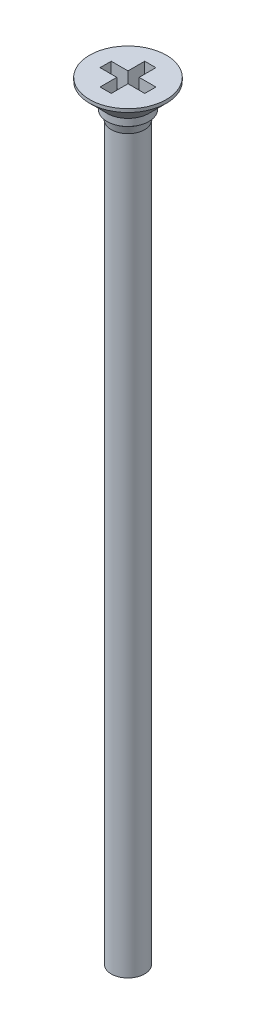
ISO-10303-21;
HEADER;
FILE_DESCRIPTION(('STEP AP214'),'2;1');
FILE_NAME('part.step','',(''),(''),'','','');
FILE_SCHEMA(('AUTOMOTIVE_DESIGN { 1 0 10303 214 1 1 1 1 }'));
ENDSEC;
DATA;
#1=APPLICATION_CONTEXT('core data for automotive mechanical design processes');
#2=APPLICATION_PROTOCOL_DEFINITION('international standard','automotive_design',2000,#1);
#3=PRODUCT_CONTEXT('',#1,'mechanical');
#4=PRODUCT('Part','Part','',(#3));
#5=PRODUCT_RELATED_PRODUCT_CATEGORY('part','',(#4));
#6=PRODUCT_DEFINITION_FORMATION('','',#4);
#7=PRODUCT_DEFINITION_CONTEXT('part definition',#1,'design');
#8=PRODUCT_DEFINITION('design','',#6,#7);
#9=PRODUCT_DEFINITION_SHAPE('','',#8);
#10=(LENGTH_UNIT() NAMED_UNIT(*) SI_UNIT(.MILLI.,.METRE.));
#11=(NAMED_UNIT(*) PLANE_ANGLE_UNIT() SI_UNIT($,.RADIAN.));
#12=(NAMED_UNIT(*) SI_UNIT($,.STERADIAN.) SOLID_ANGLE_UNIT());
#13=UNCERTAINTY_MEASURE_WITH_UNIT(LENGTH_MEASURE(1.E-05),#10,'distance_accuracy_value','');
#14=(GEOMETRIC_REPRESENTATION_CONTEXT(3) GLOBAL_UNCERTAINTY_ASSIGNED_CONTEXT((#13)) GLOBAL_UNIT_ASSIGNED_CONTEXT((#10,
#11,#12)) REPRESENTATION_CONTEXT('',''));
#15=CARTESIAN_POINT('',(0.,0.,0.));
#16=DIRECTION('',(0.,0.,1.));
#17=DIRECTION('',(1.,0.,0.));
#18=AXIS2_PLACEMENT_3D('',#15,#16,#17);
#19=CARTESIAN_POINT('',(0.,-2.65,-0.4));
#20=DIRECTION('',(0.,0.,-1.));
#21=DIRECTION('',(-1.,0.,0.));
#22=AXIS2_PLACEMENT_3D('',#19,#20,#21);
#23=PLANE('',#22);
#24=DIRECTION('',(0.,1.,0.));
#25=VECTOR('',#24,1.);
#26=CARTESIAN_POINT('',(0.4,-2.65,-0.4));
#27=LINE('',#26,#25);
#28=CARTESIAN_POINT('',(0.4,-2.1,-0.4));
#29=VERTEX_POINT('',#28);
#30=CARTESIAN_POINT('',(0.4,0.,-0.4));
#31=VERTEX_POINT('',#30);
#32=EDGE_CURVE('E220',#29,#31,#27,.T.);
#33=ORIENTED_EDGE('',*,*,#32,.F.);
#34=DIRECTION('',(1.,0.,0.));
#35=VECTOR('',#34,1.);
#36=CARTESIAN_POINT('',(-0.550000000000002,-2.1,-0.4));
#37=LINE('',#36,#35);
#38=CARTESIAN_POINT('',(0.550000000000002,-2.1,-0.4));
#39=VERTEX_POINT('',#38);
#40=EDGE_CURVE('E255',#29,#39,#37,.T.);
#41=ORIENTED_EDGE('',*,*,#40,.T.);
#42=DIRECTION('',(0.707106781186546,0.707106781186548,0.));
#43=VECTOR('',#42,1.);
#44=CARTESIAN_POINT('',(1.6,-1.05,-0.4));
#45=LINE('',#44,#43);
#46=CARTESIAN_POINT('',(1.6,-1.05,-0.4));
#47=VERTEX_POINT('',#46);
#48=EDGE_CURVE('E259',#39,#47,#45,.T.);
#49=ORIENTED_EDGE('',*,*,#48,.T.);
#50=DIRECTION('',(0.,1.,0.));
#51=VECTOR('',#50,1.);
#52=CARTESIAN_POINT('',(1.6,0.,-0.4));
#53=LINE('',#52,#51);
#54=CARTESIAN_POINT('',(1.6,0.,-0.4));
#55=VERTEX_POINT('',#54);
#56=EDGE_CURVE('E262',#47,#55,#53,.T.);
#57=ORIENTED_EDGE('',*,*,#56,.T.);
#58=DIRECTION('',(-1.,0.,0.));
#59=VECTOR('',#58,1.);
#60=CARTESIAN_POINT('',(1.6,0.,-0.4));
#61=LINE('',#60,#59);
#62=EDGE_CURVE('E266',#55,#31,#61,.T.);
#63=ORIENTED_EDGE('',*,*,#62,.T.);
#64=EDGE_LOOP('',(#33,#41,#49,#57,#63));
#65=FACE_BOUND('',#64,.T.);
#66=ADVANCED_FACE('F55',(#65),#23,.F.);
#67=CARTESIAN_POINT('',(0.,-2.65,0.4));
#68=DIRECTION('',(0.,0.,-1.));
#69=DIRECTION('',(-1.,0.,0.));
#70=AXIS2_PLACEMENT_3D('',#67,#68,#69);
#71=PLANE('',#70);
#72=DIRECTION('',(1.,0.,0.));
#73=VECTOR('',#72,1.);
#74=CARTESIAN_POINT('',(-0.550000000000002,-2.1,0.4));
#75=LINE('',#74,#73);
#76=CARTESIAN_POINT('',(0.4,-2.1,0.4));
#77=VERTEX_POINT('',#76);
#78=CARTESIAN_POINT('',(0.550000000000002,-2.1,0.4));
#79=VERTEX_POINT('',#78);
#80=EDGE_CURVE('E237',#77,#79,#75,.T.);
#81=ORIENTED_EDGE('',*,*,#80,.F.);
#82=DIRECTION('',(0.,1.,0.));
#83=VECTOR('',#82,1.);
#84=CARTESIAN_POINT('',(0.4,-2.65,0.4));
#85=LINE('',#84,#83);
#86=CARTESIAN_POINT('',(0.4,0.,0.4));
#87=VERTEX_POINT('',#86);
#88=EDGE_CURVE('E63',#77,#87,#85,.T.);
#89=ORIENTED_EDGE('',*,*,#88,.T.);
#90=DIRECTION('',(-1.,0.,0.));
#91=VECTOR('',#90,1.);
#92=CARTESIAN_POINT('',(1.6,0.,0.4));
#93=LINE('',#92,#91);
#94=CARTESIAN_POINT('',(1.6,0.,0.4));
#95=VERTEX_POINT('',#94);
#96=EDGE_CURVE('E246',#95,#87,#93,.T.);
#97=ORIENTED_EDGE('',*,*,#96,.F.);
#98=DIRECTION('',(0.,1.,0.));
#99=VECTOR('',#98,1.);
#100=CARTESIAN_POINT('',(1.6,0.,0.4));
#101=LINE('',#100,#99);
#102=CARTESIAN_POINT('',(1.6,-1.05,0.4));
#103=VERTEX_POINT('',#102);
#104=EDGE_CURVE('E243',#103,#95,#101,.T.);
#105=ORIENTED_EDGE('',*,*,#104,.F.);
#106=DIRECTION('',(0.707106781186546,0.707106781186548,0.));
#107=VECTOR('',#106,1.);
#108=CARTESIAN_POINT('',(1.6,-1.05,0.4));
#109=LINE('',#108,#107);
#110=EDGE_CURVE('E240',#79,#103,#109,.T.);
#111=ORIENTED_EDGE('',*,*,#110,.F.);
#112=EDGE_LOOP('',(#81,#89,#97,#105,#111));
#113=FACE_BOUND('',#112,.T.);
#114=ADVANCED_FACE('F309',(#113),#71,.T.);
#115=CARTESIAN_POINT('',(0.,0.,0.));
#116=DIRECTION('',(0.,-1.,0.));
#117=DIRECTION('',(1.,0.,0.));
#118=AXIS2_PLACEMENT_3D('',#115,#116,#117);
#119=PLANE('',#118);
#120=DIRECTION('',(1.,0.,0.));
#121=VECTOR('',#120,1.);
#122=CARTESIAN_POINT('',(-0.4,0.,1.6));
#123=LINE('',#122,#121);
#124=CARTESIAN_POINT('',(-0.4,0.,1.6));
#125=VERTEX_POINT('',#124);
#126=CARTESIAN_POINT('',(0.4,0.,1.6));
#127=VERTEX_POINT('',#126);
#128=EDGE_CURVE('E221',#125,#127,#123,.T.);
#129=ORIENTED_EDGE('',*,*,#128,.F.);
#130=DIRECTION('',(0.,0.,1.));
#131=VECTOR('',#130,1.);
#132=CARTESIAN_POINT('',(-0.4,0.,-1.6));
#133=LINE('',#132,#131);
#134=CARTESIAN_POINT('',(-0.4,0.,0.399999999999999));
#135=VERTEX_POINT('',#134);
#136=EDGE_CURVE('E214',#135,#125,#133,.T.);
#137=ORIENTED_EDGE('',*,*,#136,.F.);
#138=CARTESIAN_POINT('',(-1.6,0.,0.4));
#139=VERTEX_POINT('',#138);
#140=EDGE_CURVE('E245',#135,#139,#93,.T.);
#141=ORIENTED_EDGE('',*,*,#140,.T.);
#142=DIRECTION('',(0.,0.,1.));
#143=VECTOR('',#142,1.);
#144=CARTESIAN_POINT('',(-1.6,0.,-0.4));
#145=LINE('',#144,#143);
#146=CARTESIAN_POINT('',(-1.6,0.,-0.4));
#147=VERTEX_POINT('',#146);
#148=EDGE_CURVE('E276',#147,#139,#145,.T.);
#149=ORIENTED_EDGE('',*,*,#148,.F.);
#150=CARTESIAN_POINT('',(-0.4,0.,-0.4));
#151=VERTEX_POINT('',#150);
#152=EDGE_CURVE('E265',#151,#147,#61,.T.);
#153=ORIENTED_EDGE('',*,*,#152,.F.);
#154=CARTESIAN_POINT('',(-0.4,0.,-1.6));
#155=VERTEX_POINT('',#154);
#156=EDGE_CURVE('E215',#155,#151,#133,.T.);
#157=ORIENTED_EDGE('',*,*,#156,.F.);
#158=DIRECTION('',(1.,0.,0.));
#159=VECTOR('',#158,1.);
#160=CARTESIAN_POINT('',(-0.4,0.,-1.6));
#161=LINE('',#160,#159);
#162=CARTESIAN_POINT('',(0.4,0.,-1.6));
#163=VERTEX_POINT('',#162);
#164=EDGE_CURVE('E223',#155,#163,#161,.T.);
#165=ORIENTED_EDGE('',*,*,#164,.T.);
#166=DIRECTION('',(0.,0.,1.));
#167=VECTOR('',#166,1.);
#168=CARTESIAN_POINT('',(0.4,0.,-1.6));
#169=LINE('',#168,#167);
#170=EDGE_CURVE('E199',#163,#31,#169,.T.);
#171=ORIENTED_EDGE('',*,*,#170,.T.);
#172=ORIENTED_EDGE('',*,*,#62,.F.);
#173=DIRECTION('',(0.,0.,1.));
#174=VECTOR('',#173,1.);
#175=CARTESIAN_POINT('',(1.6,0.,-0.4));
#176=LINE('',#175,#174);
#177=EDGE_CURVE('E279',#55,#95,#176,.T.);
#178=ORIENTED_EDGE('',*,*,#177,.T.);
#179=ORIENTED_EDGE('',*,*,#96,.T.);
#180=EDGE_CURVE('E78',#87,#127,#169,.T.);
#181=ORIENTED_EDGE('',*,*,#180,.T.);
#182=EDGE_LOOP('',(#129,#137,#141,#149,#153,#157,#165,#171,#172,#178,#179,#181));
#183=FACE_BOUND('',#182,.T.);
#184=CARTESIAN_POINT('',(0.,0.,0.));
#185=DIRECTION('',(0.,1.,0.));
#186=DIRECTION('',(-1.,0.,0.));
#187=AXIS2_PLACEMENT_3D('',#184,#185,#186);
#188=CIRCLE('',#187,2.75);
#189=CARTESIAN_POINT('',(-2.75,0.,0.));
#190=VERTEX_POINT('',#189);
#191=EDGE_CURVE('E305',#190,#190,#188,.T.);
#192=ORIENTED_EDGE('',*,*,#191,.T.);
#193=EDGE_LOOP('',(#192));
#194=FACE_BOUND('',#193,.T.);
#195=ADVANCED_FACE('F57',(#183,#194),#119,.F.);
#196=CARTESIAN_POINT('',(0.,0.,0.));
#197=DIRECTION('',(0.,1.,0.));
#198=DIRECTION('',(-1.,0.,0.));
#199=AXIS2_PLACEMENT_3D('',#196,#197,#198);
#200=CYLINDRICAL_SURFACE('',#199,2.75);
#201=ORIENTED_EDGE('',*,*,#191,.F.);
#202=EDGE_LOOP('',(#201));
#203=FACE_BOUND('',#202,.T.);
#204=CARTESIAN_POINT('',(0.,-0.237500000000007,0.));
#205=DIRECTION('',(0.,1.,0.));
#206=DIRECTION('',(-1.,0.,0.));
#207=AXIS2_PLACEMENT_3D('',#204,#205,#206);
#208=CIRCLE('',#207,2.75);
#209=CARTESIAN_POINT('',(-2.75,-0.237500000000007,0.));
#210=VERTEX_POINT('',#209);
#211=EDGE_CURVE('E302',#210,#210,#208,.T.);
#212=ORIENTED_EDGE('',*,*,#211,.T.);
#213=EDGE_LOOP('',(#212));
#214=FACE_BOUND('',#213,.T.);
#215=ADVANCED_FACE('F414',(#203,#214),#200,.T.);
#216=CARTESIAN_POINT('',(0.,-1.4875,0.));
#217=DIRECTION('',(0.,1.,0.));
#218=DIRECTION('',(-1.,0.,0.));
#219=AXIS2_PLACEMENT_3D('',#216,#217,#218);
#220=CONICAL_SURFACE('',#219,1.5,0.78539816339745);
#221=ORIENTED_EDGE('',*,*,#211,.F.);
#222=EDGE_LOOP('',(#221));
#223=FACE_BOUND('',#222,.T.);
#224=CARTESIAN_POINT('',(0.,-1.4875,0.));
#225=DIRECTION('',(0.,1.,0.));
#226=DIRECTION('',(-1.,0.,0.));
#227=AXIS2_PLACEMENT_3D('',#224,#225,#226);
#228=CIRCLE('',#227,1.5);
#229=CARTESIAN_POINT('',(-1.5,-1.4875,0.));
#230=VERTEX_POINT('',#229);
#231=EDGE_CURVE('E299',#230,#230,#228,.T.);
#232=ORIENTED_EDGE('',*,*,#231,.T.);
#233=EDGE_LOOP('',(#232));
#234=FACE_BOUND('',#233,.T.);
#235=ADVANCED_FACE('F411',(#223,#234),#220,.T.);
#236=CARTESIAN_POINT('',(0.,0.,0.));
#237=DIRECTION('',(0.,1.,0.));
#238=DIRECTION('',(-1.,0.,0.));
#239=AXIS2_PLACEMENT_3D('',#236,#237,#238);
#240=CYLINDRICAL_SURFACE('',#239,1.5);
#241=ORIENTED_EDGE('',*,*,#231,.F.);
#242=EDGE_LOOP('',(#241));
#243=FACE_BOUND('',#242,.T.);
#244=CARTESIAN_POINT('',(0.,-1.9875,0.));
#245=DIRECTION('',(0.,1.,0.));
#246=DIRECTION('',(-1.,0.,0.));
#247=AXIS2_PLACEMENT_3D('',#244,#245,#246);
#248=CIRCLE('',#247,1.5);
#249=CARTESIAN_POINT('',(-1.5,-1.9875,0.));
#250=VERTEX_POINT('',#249);
#251=EDGE_CURVE('E296',#250,#250,#248,.T.);
#252=ORIENTED_EDGE('',*,*,#251,.T.);
#253=EDGE_LOOP('',(#252));
#254=FACE_BOUND('',#253,.T.);
#255=ADVANCED_FACE('F407',(#243,#254),#240,.T.);
#256=CARTESIAN_POINT('',(1.5,-1.9875,0.));
#257=DIRECTION('',(0.,1.,0.));
#258=DIRECTION('',(-1.,0.,0.));
#259=AXIS2_PLACEMENT_3D('',#256,#257,#258);
#260=PLANE('',#259);
#261=ORIENTED_EDGE('',*,*,#251,.F.);
#262=EDGE_LOOP('',(#261));
#263=FACE_BOUND('',#262,.T.);
#264=CARTESIAN_POINT('',(0.,-1.9875,0.));
#265=DIRECTION('',(0.,1.,0.));
#266=DIRECTION('',(-1.,0.,0.));
#267=AXIS2_PLACEMENT_3D('',#264,#265,#266);
#268=CIRCLE('',#267,1.3375);
#269=CARTESIAN_POINT('',(-1.3375,-1.9875,0.));
#270=VERTEX_POINT('',#269);
#271=EDGE_CURVE('E293',#270,#270,#268,.T.);
#272=ORIENTED_EDGE('',*,*,#271,.T.);
#273=EDGE_LOOP('',(#272));
#274=FACE_BOUND('',#273,.T.);
#275=ADVANCED_FACE('F403',(#263,#274),#260,.F.);
#276=CARTESIAN_POINT('',(0.,0.,0.));
#277=DIRECTION('',(0.,1.,0.));
#278=DIRECTION('',(-1.,0.,0.));
#279=AXIS2_PLACEMENT_3D('',#276,#277,#278);
#280=CYLINDRICAL_SURFACE('',#279,1.3375);
#281=ORIENTED_EDGE('',*,*,#271,.F.);
#282=EDGE_LOOP('',(#281));
#283=FACE_BOUND('',#282,.T.);
#284=CARTESIAN_POINT('',(0.,-2.11258468371008,0.));
#285=DIRECTION('',(0.,1.,0.));
#286=DIRECTION('',(-1.,0.,0.));
#287=AXIS2_PLACEMENT_3D('',#284,#285,#286);
#288=CIRCLE('',#287,1.3375);
#289=CARTESIAN_POINT('',(-1.3375,-2.11258468371008,0.));
#290=VERTEX_POINT('',#289);
#291=EDGE_CURVE('E290',#290,#290,#288,.T.);
#292=ORIENTED_EDGE('',*,*,#291,.T.);
#293=EDGE_LOOP('',(#292));
#294=FACE_BOUND('',#293,.T.);
#295=ADVANCED_FACE('F399',(#283,#294),#280,.T.);
#296=CARTESIAN_POINT('',(0.,-2.65,0.));
#297=DIRECTION('',(0.,1.,0.));
#298=DIRECTION('',(-1.,0.,0.));
#299=AXIS2_PLACEMENT_3D('',#296,#297,#298);
#300=CONICAL_SURFACE('',#299,1.1935,0.26179938779915);
#301=ORIENTED_EDGE('',*,*,#291,.F.);
#302=EDGE_LOOP('',(#301));
#303=FACE_BOUND('',#302,.T.);
#304=CARTESIAN_POINT('',(0.,-2.65,0.));
#305=DIRECTION('',(0.,1.,0.));
#306=DIRECTION('',(-1.,0.,0.));
#307=AXIS2_PLACEMENT_3D('',#304,#305,#306);
#308=CIRCLE('',#307,1.1935);
#309=CARTESIAN_POINT('',(-1.1935,-2.65,0.));
#310=VERTEX_POINT('',#309);
#311=EDGE_CURVE('E275',#310,#310,#308,.T.);
#312=ORIENTED_EDGE('',*,*,#311,.T.);
#313=EDGE_LOOP('',(#312));
#314=FACE_BOUND('',#313,.T.);
#315=ADVANCED_FACE('F395',(#303,#314),#300,.T.);
#316=CARTESIAN_POINT('',(0.,0.,0.));
#317=DIRECTION('',(0.,1.,0.));
#318=DIRECTION('',(-1.,0.,0.));
#319=AXIS2_PLACEMENT_3D('',#316,#317,#318);
#320=CYLINDRICAL_SURFACE('',#319,1.1935);
#321=ORIENTED_EDGE('',*,*,#311,.F.);
#322=EDGE_LOOP('',(#321));
#323=FACE_BOUND('',#322,.T.);
#324=CARTESIAN_POINT('',(0.,-55.,0.));
#325=DIRECTION('',(0.,-1.,0.));
#326=DIRECTION('',(1.,0.,0.));
#327=AXIS2_PLACEMENT_3D('',#324,#325,#326);
#328=CIRCLE('',#327,1.1935);
#329=CARTESIAN_POINT('',(1.19350000000001,-55.,0.));
#330=VERTEX_POINT('',#329);
#331=EDGE_CURVE('E190',#330,#330,#328,.T.);
#332=ORIENTED_EDGE('',*,*,#331,.F.);
#333=EDGE_LOOP('',(#332));
#334=FACE_BOUND('',#333,.T.);
#335=ADVANCED_FACE('F392',(#323,#334),#320,.T.);
#336=CARTESIAN_POINT('',(-1.6,-1.05,-0.4));
#337=DIRECTION('',(-0.707106781186548,-0.707106781186546,0.));
#338=DIRECTION('',(0.707106781186547,-0.707106781186548,0.));
#339=AXIS2_PLACEMENT_3D('',#336,#337,#338);
#340=PLANE('',#339);
#341=DIRECTION('',(0.,0.,1.));
#342=VECTOR('',#341,1.);
#343=CARTESIAN_POINT('',(-0.550000000000002,-2.1,-0.4));
#344=LINE('',#343,#342);
#345=CARTESIAN_POINT('',(-0.550000000000002,-2.1,-0.4));
#346=VERTEX_POINT('',#345);
#347=CARTESIAN_POINT('',(-0.550000000000002,-2.1,0.4));
#348=VERTEX_POINT('',#347);
#349=EDGE_CURVE('E272',#346,#348,#344,.T.);
#350=ORIENTED_EDGE('',*,*,#349,.F.);
#351=DIRECTION('',(0.707106781186546,-0.707106781186548,0.));
#352=VECTOR('',#351,1.);
#353=CARTESIAN_POINT('',(-1.6,-1.05,-0.4));
#354=LINE('',#353,#352);
#355=CARTESIAN_POINT('',(-1.6,-1.05,-0.4));
#356=VERTEX_POINT('',#355);
#357=EDGE_CURVE('E252',#356,#346,#354,.T.);
#358=ORIENTED_EDGE('',*,*,#357,.F.);
#359=DIRECTION('',(0.,0.,1.));
#360=VECTOR('',#359,1.);
#361=CARTESIAN_POINT('',(-1.6,-1.05,-0.4));
#362=LINE('',#361,#360);
#363=CARTESIAN_POINT('',(-1.6,-1.05,0.4));
#364=VERTEX_POINT('',#363);
#365=EDGE_CURVE('E273',#356,#364,#362,.T.);
#366=ORIENTED_EDGE('',*,*,#365,.T.);
#367=DIRECTION('',(0.707106781186546,-0.707106781186548,0.));
#368=VECTOR('',#367,1.);
#369=CARTESIAN_POINT('',(-1.6,-1.05,0.4));
#370=LINE('',#369,#368);
#371=EDGE_CURVE('E234',#364,#348,#370,.T.);
#372=ORIENTED_EDGE('',*,*,#371,.T.);
#373=EDGE_LOOP('',(#350,#358,#366,#372));
#374=FACE_BOUND('',#373,.T.);
#375=ADVANCED_FACE('F346',(#374),#340,.F.);
#376=CARTESIAN_POINT('',(-1.6,0.,-0.4));
#377=DIRECTION('',(-1.,0.,0.));
#378=DIRECTION('',(0.,0.,1.));
#379=AXIS2_PLACEMENT_3D('',#376,#377,#378);
#380=PLANE('',#379);
#381=ORIENTED_EDGE('',*,*,#365,.F.);
#382=DIRECTION('',(0.,-1.,0.));
#383=VECTOR('',#382,1.);
#384=CARTESIAN_POINT('',(-1.6,0.,-0.4));
#385=LINE('',#384,#383);
#386=EDGE_CURVE('E269',#147,#356,#385,.T.);
#387=ORIENTED_EDGE('',*,*,#386,.F.);
#388=ORIENTED_EDGE('',*,*,#148,.T.);
#389=DIRECTION('',(0.,-1.,0.));
#390=VECTOR('',#389,1.);
#391=CARTESIAN_POINT('',(-1.6,0.,0.4));
#392=LINE('',#391,#390);
#393=EDGE_CURVE('E249',#139,#364,#392,.T.);
#394=ORIENTED_EDGE('',*,*,#393,.T.);
#395=EDGE_LOOP('',(#381,#387,#388,#394));
#396=FACE_BOUND('',#395,.T.);
#397=ADVANCED_FACE('F391',(#396),#380,.F.);
#398=CARTESIAN_POINT('',(1.6,0.,-0.4));
#399=DIRECTION('',(1.,0.,0.));
#400=DIRECTION('',(0.,0.,-1.));
#401=AXIS2_PLACEMENT_3D('',#398,#399,#400);
#402=PLANE('',#401);
#403=ORIENTED_EDGE('',*,*,#177,.F.);
#404=ORIENTED_EDGE('',*,*,#56,.F.);
#405=DIRECTION('',(0.,0.,1.));
#406=VECTOR('',#405,1.);
#407=CARTESIAN_POINT('',(1.6,-1.05,-0.4));
#408=LINE('',#407,#406);
#409=EDGE_CURVE('E282',#47,#103,#408,.T.);
#410=ORIENTED_EDGE('',*,*,#409,.T.);
#411=ORIENTED_EDGE('',*,*,#104,.T.);
#412=EDGE_LOOP('',(#403,#404,#410,#411));
#413=FACE_BOUND('',#412,.T.);
#414=ADVANCED_FACE('F318',(#413),#402,.F.);
#415=CARTESIAN_POINT('',(1.6,-1.05,-0.4));
#416=DIRECTION('',(0.707106781186548,-0.707106781186546,0.));
#417=DIRECTION('',(0.707106781186547,0.707106781186548,0.));
#418=AXIS2_PLACEMENT_3D('',#415,#416,#417);
#419=PLANE('',#418);
#420=ORIENTED_EDGE('',*,*,#409,.F.);
#421=ORIENTED_EDGE('',*,*,#48,.F.);
#422=DIRECTION('',(0.,0.,1.));
#423=VECTOR('',#422,1.);
#424=CARTESIAN_POINT('',(0.550000000000002,-2.1,-0.4));
#425=LINE('',#424,#423);
#426=EDGE_CURVE('E284',#39,#79,#425,.T.);
#427=ORIENTED_EDGE('',*,*,#426,.T.);
#428=ORIENTED_EDGE('',*,*,#110,.T.);
#429=EDGE_LOOP('',(#420,#421,#427,#428));
#430=FACE_BOUND('',#429,.T.);
#431=ADVANCED_FACE('F324',(#430),#419,.F.);
#432=CARTESIAN_POINT('',(-0.550000000000002,-2.1,-0.4));
#433=DIRECTION('',(0.,-1.,0.));
#434=DIRECTION('',(0.,0.,-1.));
#435=AXIS2_PLACEMENT_3D('',#432,#433,#434);
#436=PLANE('',#435);
#437=CARTESIAN_POINT('',(-0.4,-2.1,0.4));
#438=VERTEX_POINT('',#437);
#439=EDGE_CURVE('E238',#348,#438,#75,.T.);
#440=ORIENTED_EDGE('',*,*,#439,.T.);
#441=DIRECTION('',(0.,0.,-1.));
#442=VECTOR('',#441,1.);
#443=CARTESIAN_POINT('',(-0.4,-2.1,0.550000000000002));
#444=LINE('',#443,#442);
#445=CARTESIAN_POINT('',(-0.4,-2.1,0.550000000000002));
#446=VERTEX_POINT('',#445);
#447=EDGE_CURVE('E174',#446,#438,#444,.T.);
#448=ORIENTED_EDGE('',*,*,#447,.F.);
#449=DIRECTION('',(1.,0.,0.));
#450=VECTOR('',#449,1.);
#451=CARTESIAN_POINT('',(-0.4,-2.1,0.550000000000002));
#452=LINE('',#451,#450);
#453=CARTESIAN_POINT('',(0.4,-2.1,0.550000000000002));
#454=VERTEX_POINT('',#453);
#455=EDGE_CURVE('E168',#446,#454,#452,.T.);
#456=ORIENTED_EDGE('',*,*,#455,.T.);
#457=DIRECTION('',(0.,0.,-1.));
#458=VECTOR('',#457,1.);
#459=CARTESIAN_POINT('',(0.4,-2.1,0.550000000000002));
#460=LINE('',#459,#458);
#461=EDGE_CURVE('E172',#454,#77,#460,.T.);
#462=ORIENTED_EDGE('',*,*,#461,.T.);
#463=ORIENTED_EDGE('',*,*,#80,.T.);
#464=ORIENTED_EDGE('',*,*,#426,.F.);
#465=ORIENTED_EDGE('',*,*,#40,.F.);
#466=CARTESIAN_POINT('',(0.4,-2.1,-0.550000000000002));
#467=VERTEX_POINT('',#466);
#468=EDGE_CURVE('E70',#29,#467,#460,.T.);
#469=ORIENTED_EDGE('',*,*,#468,.T.);
#470=DIRECTION('',(1.,0.,0.));
#471=VECTOR('',#470,1.);
#472=CARTESIAN_POINT('',(-0.4,-2.1,-0.550000000000002));
#473=LINE('',#472,#471);
#474=CARTESIAN_POINT('',(-0.4,-2.1,-0.550000000000002));
#475=VERTEX_POINT('',#474);
#476=EDGE_CURVE('E179',#475,#467,#473,.T.);
#477=ORIENTED_EDGE('',*,*,#476,.F.);
#478=CARTESIAN_POINT('',(-0.4,-2.1,-0.4));
#479=VERTEX_POINT('',#478);
#480=EDGE_CURVE('E206',#479,#475,#444,.T.);
#481=ORIENTED_EDGE('',*,*,#480,.F.);
#482=EDGE_CURVE('E256',#346,#479,#37,.T.);
#483=ORIENTED_EDGE('',*,*,#482,.F.);
#484=ORIENTED_EDGE('',*,*,#349,.T.);
#485=EDGE_LOOP('',(#440,#448,#456,#462,#463,#464,#465,#469,#477,#481,#483,#484));
#486=FACE_BOUND('',#485,.T.);
#487=ADVANCED_FACE('F171',(#486),#436,.F.);
#488=ORIENTED_EDGE('',*,*,#482,.T.);
#489=DIRECTION('',(0.,1.,0.));
#490=VECTOR('',#489,1.);
#491=CARTESIAN_POINT('',(-0.4,-2.65,-0.4));
#492=LINE('',#491,#490);
#493=EDGE_CURVE('E231',#479,#151,#492,.T.);
#494=ORIENTED_EDGE('',*,*,#493,.T.);
#495=ORIENTED_EDGE('',*,*,#152,.T.);
#496=ORIENTED_EDGE('',*,*,#386,.T.);
#497=ORIENTED_EDGE('',*,*,#357,.T.);
#498=EDGE_LOOP('',(#488,#494,#495,#496,#497));
#499=FACE_BOUND('',#498,.T.);
#500=ADVANCED_FACE('F341',(#499),#23,.F.);
#501=DIRECTION('',(0.,1.,0.));
#502=VECTOR('',#501,1.);
#503=CARTESIAN_POINT('',(-0.4,-2.65,0.4));
#504=LINE('',#503,#502);
#505=EDGE_CURVE('E13',#438,#135,#504,.T.);
#506=ORIENTED_EDGE('',*,*,#505,.F.);
#507=ORIENTED_EDGE('',*,*,#439,.F.);
#508=ORIENTED_EDGE('',*,*,#371,.F.);
#509=ORIENTED_EDGE('',*,*,#393,.F.);
#510=ORIENTED_EDGE('',*,*,#140,.F.);
#511=EDGE_LOOP('',(#506,#507,#508,#509,#510));
#512=FACE_BOUND('',#511,.T.);
#513=ADVANCED_FACE('F351',(#512),#71,.T.);
#514=CARTESIAN_POINT('',(-0.4,-1.05,1.6));
#515=DIRECTION('',(0.,-0.707106781186546,0.707106781186548));
#516=DIRECTION('',(0.,-0.707106781186548,-0.707106781186547));
#517=AXIS2_PLACEMENT_3D('',#514,#515,#516);
#518=PLANE('',#517);
#519=ORIENTED_EDGE('',*,*,#455,.F.);
#520=DIRECTION('',(0.,-0.707106781186548,-0.707106781186546));
#521=VECTOR('',#520,1.);
#522=CARTESIAN_POINT('',(-0.4,-1.05,1.6));
#523=LINE('',#522,#521);
#524=CARTESIAN_POINT('',(-0.4,-1.05,1.6));
#525=VERTEX_POINT('',#524);
#526=EDGE_CURVE('E204',#525,#446,#523,.T.);
#527=ORIENTED_EDGE('',*,*,#526,.F.);
#528=DIRECTION('',(1.,0.,0.));
#529=VECTOR('',#528,1.);
#530=CARTESIAN_POINT('',(-0.4,-1.05,1.6));
#531=LINE('',#530,#529);
#532=CARTESIAN_POINT('',(0.4,-1.05,1.6));
#533=VERTEX_POINT('',#532);
#534=EDGE_CURVE('E188',#525,#533,#531,.T.);
#535=ORIENTED_EDGE('',*,*,#534,.T.);
#536=DIRECTION('',(0.,-0.707106781186548,-0.707106781186546));
#537=VECTOR('',#536,1.);
#538=CARTESIAN_POINT('',(0.4,-1.05,1.6));
#539=LINE('',#538,#537);
#540=EDGE_CURVE('E184',#533,#454,#539,.T.);
#541=ORIENTED_EDGE('',*,*,#540,.T.);
#542=EDGE_LOOP('',(#519,#527,#535,#541));
#543=FACE_BOUND('',#542,.T.);
#544=ADVANCED_FACE('F187',(#543),#518,.F.);
#545=CARTESIAN_POINT('',(-0.4,-2.65,0.));
#546=DIRECTION('',(-1.,0.,0.));
#547=DIRECTION('',(0.,0.,1.));
#548=AXIS2_PLACEMENT_3D('',#545,#546,#547);
#549=PLANE('',#548);
#550=ORIENTED_EDGE('',*,*,#505,.T.);
#551=ORIENTED_EDGE('',*,*,#136,.T.);
#552=DIRECTION('',(0.,-1.,0.));
#553=VECTOR('',#552,1.);
#554=CARTESIAN_POINT('',(-0.4,0.,1.6));
#555=LINE('',#554,#553);
#556=EDGE_CURVE('E180',#125,#525,#555,.T.);
#557=ORIENTED_EDGE('',*,*,#556,.T.);
#558=ORIENTED_EDGE('',*,*,#526,.T.);
#559=ORIENTED_EDGE('',*,*,#447,.T.);
#560=EDGE_LOOP('',(#550,#551,#557,#558,#559));
#561=FACE_BOUND('',#560,.T.);
#562=ADVANCED_FACE('F356',(#561),#549,.F.);
#563=CARTESIAN_POINT('',(0.4,-2.65,0.));
#564=DIRECTION('',(-1.,0.,0.));
#565=DIRECTION('',(0.,0.,1.));
#566=AXIS2_PLACEMENT_3D('',#563,#564,#565);
#567=PLANE('',#566);
#568=ORIENTED_EDGE('',*,*,#461,.F.);
#569=ORIENTED_EDGE('',*,*,#540,.F.);
#570=DIRECTION('',(0.,-1.,0.));
#571=VECTOR('',#570,1.);
#572=CARTESIAN_POINT('',(0.4,0.,1.6));
#573=LINE('',#572,#571);
#574=EDGE_CURVE('E202',#127,#533,#573,.T.);
#575=ORIENTED_EDGE('',*,*,#574,.F.);
#576=ORIENTED_EDGE('',*,*,#180,.F.);
#577=ORIENTED_EDGE('',*,*,#88,.F.);
#578=EDGE_LOOP('',(#568,#569,#575,#576,#577));
#579=FACE_BOUND('',#578,.T.);
#580=ADVANCED_FACE('F183',(#579),#567,.T.);
#581=CARTESIAN_POINT('',(-0.4,0.,1.6));
#582=DIRECTION('',(0.,0.,1.));
#583=DIRECTION('',(1.,0.,0.));
#584=AXIS2_PLACEMENT_3D('',#581,#582,#583);
#585=PLANE('',#584);
#586=ORIENTED_EDGE('',*,*,#534,.F.);
#587=ORIENTED_EDGE('',*,*,#556,.F.);
#588=ORIENTED_EDGE('',*,*,#128,.T.);
#589=ORIENTED_EDGE('',*,*,#574,.T.);
#590=EDGE_LOOP('',(#586,#587,#588,#589));
#591=FACE_BOUND('',#590,.T.);
#592=ADVANCED_FACE('F360',(#591),#585,.F.);
#593=ORIENTED_EDGE('',*,*,#480,.T.);
#594=DIRECTION('',(0.,0.707106781186548,-0.707106781186546));
#595=VECTOR('',#594,1.);
#596=CARTESIAN_POINT('',(-0.4,-1.05,-1.6));
#597=LINE('',#596,#595);
#598=CARTESIAN_POINT('',(-0.4,-1.05,-1.6));
#599=VERTEX_POINT('',#598);
#600=EDGE_CURVE('E208',#475,#599,#597,.T.);
#601=ORIENTED_EDGE('',*,*,#600,.T.);
#602=DIRECTION('',(0.,1.,0.));
#603=VECTOR('',#602,1.);
#604=CARTESIAN_POINT('',(-0.4,0.,-1.6));
#605=LINE('',#604,#603);
#606=EDGE_CURVE('E211',#599,#155,#605,.T.);
#607=ORIENTED_EDGE('',*,*,#606,.T.);
#608=ORIENTED_EDGE('',*,*,#156,.T.);
#609=ORIENTED_EDGE('',*,*,#493,.F.);
#610=EDGE_LOOP('',(#593,#601,#607,#608,#609));
#611=FACE_BOUND('',#610,.T.);
#612=ADVANCED_FACE('F338',(#611),#549,.F.);
#613=ORIENTED_EDGE('',*,*,#32,.T.);
#614=ORIENTED_EDGE('',*,*,#170,.F.);
#615=DIRECTION('',(0.,1.,0.));
#616=VECTOR('',#615,1.);
#617=CARTESIAN_POINT('',(0.4,0.,-1.6));
#618=LINE('',#617,#616);
#619=CARTESIAN_POINT('',(0.4,-1.05,-1.6));
#620=VERTEX_POINT('',#619);
#621=EDGE_CURVE('E197',#620,#163,#618,.T.);
#622=ORIENTED_EDGE('',*,*,#621,.F.);
#623=DIRECTION('',(0.,0.707106781186548,-0.707106781186546));
#624=VECTOR('',#623,1.);
#625=CARTESIAN_POINT('',(0.4,-1.05,-1.6));
#626=LINE('',#625,#624);
#627=EDGE_CURVE('E185',#467,#620,#626,.T.);
#628=ORIENTED_EDGE('',*,*,#627,.F.);
#629=ORIENTED_EDGE('',*,*,#468,.F.);
#630=EDGE_LOOP('',(#613,#614,#622,#628,#629));
#631=FACE_BOUND('',#630,.T.);
#632=ADVANCED_FACE('F331',(#631),#567,.T.);
#633=CARTESIAN_POINT('',(-0.4,0.,-1.6));
#634=DIRECTION('',(0.,0.,-1.));
#635=DIRECTION('',(-1.,0.,0.));
#636=AXIS2_PLACEMENT_3D('',#633,#634,#635);
#637=PLANE('',#636);
#638=ORIENTED_EDGE('',*,*,#164,.F.);
#639=ORIENTED_EDGE('',*,*,#606,.F.);
#640=DIRECTION('',(1.,0.,0.));
#641=VECTOR('',#640,1.);
#642=CARTESIAN_POINT('',(-0.4,-1.05,-1.6));
#643=LINE('',#642,#641);
#644=EDGE_CURVE('E226',#599,#620,#643,.T.);
#645=ORIENTED_EDGE('',*,*,#644,.T.);
#646=ORIENTED_EDGE('',*,*,#621,.T.);
#647=EDGE_LOOP('',(#638,#639,#645,#646));
#648=FACE_BOUND('',#647,.T.);
#649=ADVANCED_FACE('F334',(#648),#637,.F.);
#650=CARTESIAN_POINT('',(-0.4,-1.05,-1.6));
#651=DIRECTION('',(0.,-0.707106781186546,-0.707106781186548));
#652=DIRECTION('',(0.,0.707106781186548,-0.707106781186547));
#653=AXIS2_PLACEMENT_3D('',#650,#651,#652);
#654=PLANE('',#653);
#655=ORIENTED_EDGE('',*,*,#644,.F.);
#656=ORIENTED_EDGE('',*,*,#600,.F.);
#657=ORIENTED_EDGE('',*,*,#476,.T.);
#658=ORIENTED_EDGE('',*,*,#627,.T.);
#659=EDGE_LOOP('',(#655,#656,#657,#658));
#660=FACE_BOUND('',#659,.T.);
#661=ADVANCED_FACE('F329',(#660),#654,.F.);
#662=CARTESIAN_POINT('',(0.,-55.,0.));
#663=DIRECTION('',(0.,-1.,0.));
#664=DIRECTION('',(1.,0.,0.));
#665=AXIS2_PLACEMENT_3D('',#662,#663,#664);
#666=PLANE('',#665);
#667=ORIENTED_EDGE('',*,*,#331,.T.);
#668=EDGE_LOOP('',(#667));
#669=FACE_BOUND('',#668,.T.);
#670=ADVANCED_FACE('F437',(#669),#666,.T.);
#671=CLOSED_SHELL('',(#66,#114,#195,#215,#235,#255,#275,#295,#315,#335,#375,#397,#414,#431,#487,
#500,#513,#544,#562,#580,#592,#612,#632,#649,#661,#670));
#672=MANIFOLD_SOLID_BREP('B2',#671);
#673=ADVANCED_BREP_SHAPE_REPRESENTATION('',(#18,#672),#14);
#674=SHAPE_DEFINITION_REPRESENTATION(#9,#673);
ENDSEC;
END-ISO-10303-21;
